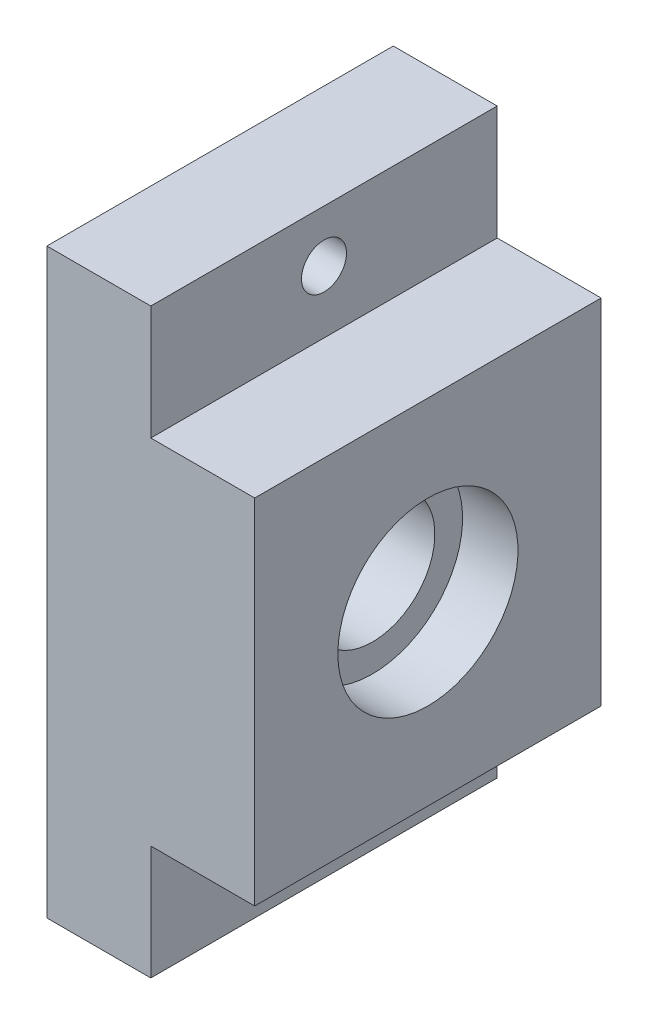
ISO-10303-21;
HEADER;
FILE_DESCRIPTION(('STEP AP214'),'2;1');
FILE_NAME('part.step','',(''),(''),'','','');
FILE_SCHEMA(('AUTOMOTIVE_DESIGN { 1 0 10303 214 1 1 1 1 }'));
ENDSEC;
DATA;
#1=APPLICATION_CONTEXT('core data for automotive mechanical design processes');
#2=APPLICATION_PROTOCOL_DEFINITION('international standard','automotive_design',2000,#1);
#3=PRODUCT_CONTEXT('',#1,'mechanical');
#4=PRODUCT('Part','Part','',(#3));
#5=PRODUCT_RELATED_PRODUCT_CATEGORY('part','',(#4));
#6=PRODUCT_DEFINITION_FORMATION('','',#4);
#7=PRODUCT_DEFINITION_CONTEXT('part definition',#1,'design');
#8=PRODUCT_DEFINITION('design','',#6,#7);
#9=PRODUCT_DEFINITION_SHAPE('','',#8);
#10=(LENGTH_UNIT() NAMED_UNIT(*) SI_UNIT(.MILLI.,.METRE.));
#11=(NAMED_UNIT(*) PLANE_ANGLE_UNIT() SI_UNIT($,.RADIAN.));
#12=(NAMED_UNIT(*) SI_UNIT($,.STERADIAN.) SOLID_ANGLE_UNIT());
#13=UNCERTAINTY_MEASURE_WITH_UNIT(LENGTH_MEASURE(1.E-05),#10,'distance_accuracy_value','');
#14=(GEOMETRIC_REPRESENTATION_CONTEXT(3) GLOBAL_UNCERTAINTY_ASSIGNED_CONTEXT((#13)) GLOBAL_UNIT_ASSIGNED_CONTEXT((#10,
#11,#12)) REPRESENTATION_CONTEXT('',''));
#15=CARTESIAN_POINT('',(0.,0.,0.));
#16=DIRECTION('',(0.,0.,1.));
#17=DIRECTION('',(1.,0.,0.));
#18=AXIS2_PLACEMENT_3D('',#15,#16,#17);
#19=CARTESIAN_POINT('',(15.,42.,50.));
#20=DIRECTION('',(0.,-1.,0.));
#21=DIRECTION('',(0.,0.,-1.));
#22=AXIS2_PLACEMENT_3D('',#19,#20,#21);
#23=PLANE('',#22);
#24=DIRECTION('',(-1.,0.,0.));
#25=VECTOR('',#24,1.);
#26=CARTESIAN_POINT('',(15.,42.,0.));
#27=LINE('',#26,#25);
#28=CARTESIAN_POINT('',(15.,42.,0.));
#29=VERTEX_POINT('',#28);
#30=CARTESIAN_POINT('',(0.,42.,0.));
#31=VERTEX_POINT('',#30);
#32=EDGE_CURVE('E128',#29,#31,#27,.T.);
#33=ORIENTED_EDGE('',*,*,#32,.T.);
#34=DIRECTION('',(0.,0.,-1.));
#35=VECTOR('',#34,1.);
#36=CARTESIAN_POINT('',(0.,42.,50.));
#37=LINE('',#36,#35);
#38=CARTESIAN_POINT('',(0.,42.,50.));
#39=VERTEX_POINT('',#38);
#40=EDGE_CURVE('E11',#39,#31,#37,.T.);
#41=ORIENTED_EDGE('',*,*,#40,.F.);
#42=DIRECTION('',(-1.,0.,0.));
#43=VECTOR('',#42,1.);
#44=CARTESIAN_POINT('',(15.,42.,50.));
#45=LINE('',#44,#43);
#46=CARTESIAN_POINT('',(15.,42.,50.));
#47=VERTEX_POINT('',#46);
#48=EDGE_CURVE('E143',#47,#39,#45,.T.);
#49=ORIENTED_EDGE('',*,*,#48,.F.);
#50=DIRECTION('',(0.,0.,-1.));
#51=VECTOR('',#50,1.);
#52=CARTESIAN_POINT('',(15.,42.,50.));
#53=LINE('',#52,#51);
#54=EDGE_CURVE('E124',#47,#29,#53,.T.);
#55=ORIENTED_EDGE('',*,*,#54,.T.);
#56=EDGE_LOOP('',(#33,#41,#49,#55));
#57=FACE_BOUND('',#56,.T.);
#58=ADVANCED_FACE('F32',(#57),#23,.F.);
#59=CARTESIAN_POINT('',(0.,42.,50.));
#60=DIRECTION('',(1.,0.,0.));
#61=DIRECTION('',(0.,0.,-1.));
#62=AXIS2_PLACEMENT_3D('',#59,#60,#61);
#63=PLANE('',#62);
#64=CARTESIAN_POINT('',(0.,0.,25.));
#65=DIRECTION('',(-1.,0.,0.));
#66=DIRECTION('',(0.,0.,1.));
#67=AXIS2_PLACEMENT_3D('',#64,#65,#66);
#68=CIRCLE('',#67,13.);
#69=CARTESIAN_POINT('',(0.,0.,38.));
#70=VERTEX_POINT('',#69);
#71=EDGE_CURVE('E187',#70,#70,#68,.T.);
#72=ORIENTED_EDGE('',*,*,#71,.F.);
#73=EDGE_LOOP('',(#72));
#74=FACE_BOUND('',#73,.T.);
#75=CARTESIAN_POINT('',(0.,-34.5,25.));
#76=DIRECTION('',(1.,0.,0.));
#77=DIRECTION('',(0.,0.,-1.));
#78=AXIS2_PLACEMENT_3D('',#75,#76,#77);
#79=CIRCLE('',#78,3.25);
#80=CARTESIAN_POINT('',(0.,-34.5,21.75));
#81=VERTEX_POINT('',#80);
#82=EDGE_CURVE('E181',#81,#81,#79,.T.);
#83=ORIENTED_EDGE('',*,*,#82,.T.);
#84=EDGE_LOOP('',(#83));
#85=FACE_BOUND('',#84,.T.);
#86=CARTESIAN_POINT('',(0.,34.5,25.));
#87=DIRECTION('',(1.,0.,0.));
#88=DIRECTION('',(0.,0.,-1.));
#89=AXIS2_PLACEMENT_3D('',#86,#87,#88);
#90=CIRCLE('',#89,3.25);
#91=CARTESIAN_POINT('',(0.,34.5,21.75));
#92=VERTEX_POINT('',#91);
#93=EDGE_CURVE('E132',#92,#92,#90,.T.);
#94=ORIENTED_EDGE('',*,*,#93,.T.);
#95=EDGE_LOOP('',(#94));
#96=FACE_BOUND('',#95,.T.);
#97=DIRECTION('',(0.,-1.,0.));
#98=VECTOR('',#97,1.);
#99=CARTESIAN_POINT('',(0.,42.,0.));
#100=LINE('',#99,#98);
#101=CARTESIAN_POINT('',(0.,-42.,0.));
#102=VERTEX_POINT('',#101);
#103=EDGE_CURVE('E131',#31,#102,#100,.T.);
#104=ORIENTED_EDGE('',*,*,#103,.T.);
#105=DIRECTION('',(0.,0.,-1.));
#106=VECTOR('',#105,1.);
#107=CARTESIAN_POINT('',(0.,-42.,50.));
#108=LINE('',#107,#106);
#109=CARTESIAN_POINT('',(0.,-42.,50.));
#110=VERTEX_POINT('',#109);
#111=EDGE_CURVE('E40',#110,#102,#108,.T.);
#112=ORIENTED_EDGE('',*,*,#111,.F.);
#113=DIRECTION('',(0.,-1.,0.));
#114=VECTOR('',#113,1.);
#115=CARTESIAN_POINT('',(0.,42.,50.));
#116=LINE('',#115,#114);
#117=EDGE_CURVE('E91',#39,#110,#116,.T.);
#118=ORIENTED_EDGE('',*,*,#117,.F.);
#119=ORIENTED_EDGE('',*,*,#40,.T.);
#120=EDGE_LOOP('',(#104,#112,#118,#119));
#121=FACE_BOUND('',#120,.T.);
#122=ADVANCED_FACE('F238',(#74,#85,#96,#121),#63,.F.);
#123=CARTESIAN_POINT('',(0.,-42.,50.));
#124=DIRECTION('',(0.,1.,0.));
#125=DIRECTION('',(0.,0.,1.));
#126=AXIS2_PLACEMENT_3D('',#123,#124,#125);
#127=PLANE('',#126);
#128=DIRECTION('',(1.,0.,0.));
#129=VECTOR('',#128,1.);
#130=CARTESIAN_POINT('',(0.,-42.,0.));
#131=LINE('',#130,#129);
#132=CARTESIAN_POINT('',(15.,-42.,0.));
#133=VERTEX_POINT('',#132);
#134=EDGE_CURVE('E134',#102,#133,#131,.T.);
#135=ORIENTED_EDGE('',*,*,#134,.T.);
#136=DIRECTION('',(0.,0.,-1.));
#137=VECTOR('',#136,1.);
#138=CARTESIAN_POINT('',(15.,-42.,50.));
#139=LINE('',#138,#137);
#140=CARTESIAN_POINT('',(15.,-42.,50.));
#141=VERTEX_POINT('',#140);
#142=EDGE_CURVE('E150',#141,#133,#139,.T.);
#143=ORIENTED_EDGE('',*,*,#142,.F.);
#144=DIRECTION('',(1.,0.,0.));
#145=VECTOR('',#144,1.);
#146=CARTESIAN_POINT('',(0.,-42.,50.));
#147=LINE('',#146,#145);
#148=EDGE_CURVE('E158',#110,#141,#147,.T.);
#149=ORIENTED_EDGE('',*,*,#148,.F.);
#150=ORIENTED_EDGE('',*,*,#111,.T.);
#151=EDGE_LOOP('',(#135,#143,#149,#150));
#152=FACE_BOUND('',#151,.T.);
#153=ADVANCED_FACE('F156',(#152),#127,.F.);
#154=CARTESIAN_POINT('',(15.,-42.,50.));
#155=DIRECTION('',(-1.,0.,0.));
#156=DIRECTION('',(0.,0.,1.));
#157=AXIS2_PLACEMENT_3D('',#154,#155,#156);
#158=PLANE('',#157);
#159=CARTESIAN_POINT('',(15.,-34.5,25.));
#160=DIRECTION('',(1.,0.,0.));
#161=DIRECTION('',(0.,0.,-1.));
#162=AXIS2_PLACEMENT_3D('',#159,#160,#161);
#163=CIRCLE('',#162,3.24999999999999);
#164=CARTESIAN_POINT('',(15.,-34.5,21.75));
#165=VERTEX_POINT('',#164);
#166=EDGE_CURVE('E184',#165,#165,#163,.T.);
#167=ORIENTED_EDGE('',*,*,#166,.F.);
#168=EDGE_LOOP('',(#167));
#169=FACE_BOUND('',#168,.T.);
#170=DIRECTION('',(0.,1.,0.));
#171=VECTOR('',#170,1.);
#172=CARTESIAN_POINT('',(15.,-42.,0.));
#173=LINE('',#172,#171);
#174=CARTESIAN_POINT('',(15.,-25.5,0.));
#175=VERTEX_POINT('',#174);
#176=EDGE_CURVE('E136',#133,#175,#173,.T.);
#177=ORIENTED_EDGE('',*,*,#176,.T.);
#178=DIRECTION('',(0.,0.,-1.));
#179=VECTOR('',#178,1.);
#180=CARTESIAN_POINT('',(15.,-25.5,50.));
#181=LINE('',#180,#179);
#182=CARTESIAN_POINT('',(15.,-25.5,50.));
#183=VERTEX_POINT('',#182);
#184=EDGE_CURVE('E147',#183,#175,#181,.T.);
#185=ORIENTED_EDGE('',*,*,#184,.F.);
#186=DIRECTION('',(0.,1.,0.));
#187=VECTOR('',#186,1.);
#188=CARTESIAN_POINT('',(15.,-42.,50.));
#189=LINE('',#188,#187);
#190=EDGE_CURVE('E170',#141,#183,#189,.T.);
#191=ORIENTED_EDGE('',*,*,#190,.F.);
#192=ORIENTED_EDGE('',*,*,#142,.T.);
#193=EDGE_LOOP('',(#177,#185,#191,#192));
#194=FACE_BOUND('',#193,.T.);
#195=ADVANCED_FACE('F166',(#169,#194),#158,.F.);
#196=CARTESIAN_POINT('',(15.,-25.5,50.));
#197=DIRECTION('',(0.,1.,0.));
#198=DIRECTION('',(0.,0.,1.));
#199=AXIS2_PLACEMENT_3D('',#196,#197,#198);
#200=PLANE('',#199);
#201=DIRECTION('',(1.,0.,0.));
#202=VECTOR('',#201,1.);
#203=CARTESIAN_POINT('',(15.,-25.5,0.));
#204=LINE('',#203,#202);
#205=CARTESIAN_POINT('',(30.,-25.5,0.));
#206=VERTEX_POINT('',#205);
#207=EDGE_CURVE('E138',#175,#206,#204,.T.);
#208=ORIENTED_EDGE('',*,*,#207,.T.);
#209=DIRECTION('',(0.,0.,-1.));
#210=VECTOR('',#209,1.);
#211=CARTESIAN_POINT('',(30.,-25.5,50.));
#212=LINE('',#211,#210);
#213=CARTESIAN_POINT('',(30.,-25.5,50.));
#214=VERTEX_POINT('',#213);
#215=EDGE_CURVE('E119',#214,#206,#212,.T.);
#216=ORIENTED_EDGE('',*,*,#215,.F.);
#217=DIRECTION('',(1.,0.,0.));
#218=VECTOR('',#217,1.);
#219=CARTESIAN_POINT('',(15.,-25.5,50.));
#220=LINE('',#219,#218);
#221=EDGE_CURVE('E110',#183,#214,#220,.T.);
#222=ORIENTED_EDGE('',*,*,#221,.F.);
#223=ORIENTED_EDGE('',*,*,#184,.T.);
#224=EDGE_LOOP('',(#208,#216,#222,#223));
#225=FACE_BOUND('',#224,.T.);
#226=ADVANCED_FACE('F169',(#225),#200,.F.);
#227=CARTESIAN_POINT('',(30.,-25.5,50.));
#228=DIRECTION('',(-1.,0.,0.));
#229=DIRECTION('',(0.,0.,1.));
#230=AXIS2_PLACEMENT_3D('',#227,#228,#229);
#231=PLANE('',#230);
#232=CARTESIAN_POINT('',(30.,0.,25.));
#233=DIRECTION('',(-1.,0.,0.));
#234=DIRECTION('',(0.,0.,1.));
#235=AXIS2_PLACEMENT_3D('',#232,#233,#234);
#236=CIRCLE('',#235,13.);
#237=CARTESIAN_POINT('',(30.,0.,38.));
#238=VERTEX_POINT('',#237);
#239=EDGE_CURVE('E202',#238,#238,#236,.T.);
#240=ORIENTED_EDGE('',*,*,#239,.T.);
#241=EDGE_LOOP('',(#240));
#242=FACE_BOUND('',#241,.T.);
#243=DIRECTION('',(0.,1.,0.));
#244=VECTOR('',#243,1.);
#245=CARTESIAN_POINT('',(30.,-25.5,0.));
#246=LINE('',#245,#244);
#247=CARTESIAN_POINT('',(30.,25.5,0.));
#248=VERTEX_POINT('',#247);
#249=EDGE_CURVE('E118',#206,#248,#246,.T.);
#250=ORIENTED_EDGE('',*,*,#249,.T.);
#251=DIRECTION('',(0.,0.,-1.));
#252=VECTOR('',#251,1.);
#253=CARTESIAN_POINT('',(30.,25.5,50.));
#254=LINE('',#253,#252);
#255=CARTESIAN_POINT('',(30.,25.5,50.));
#256=VERTEX_POINT('',#255);
#257=EDGE_CURVE('E115',#256,#248,#254,.T.);
#258=ORIENTED_EDGE('',*,*,#257,.F.);
#259=DIRECTION('',(0.,1.,0.));
#260=VECTOR('',#259,1.);
#261=CARTESIAN_POINT('',(30.,-25.5,50.));
#262=LINE('',#261,#260);
#263=EDGE_CURVE('E104',#214,#256,#262,.T.);
#264=ORIENTED_EDGE('',*,*,#263,.F.);
#265=ORIENTED_EDGE('',*,*,#215,.T.);
#266=EDGE_LOOP('',(#250,#258,#264,#265));
#267=FACE_BOUND('',#266,.T.);
#268=ADVANCED_FACE('F116',(#242,#267),#231,.F.);
#269=CARTESIAN_POINT('',(30.,25.5,50.));
#270=DIRECTION('',(0.,-1.,0.));
#271=DIRECTION('',(0.,0.,-1.));
#272=AXIS2_PLACEMENT_3D('',#269,#270,#271);
#273=PLANE('',#272);
#274=DIRECTION('',(-1.,0.,0.));
#275=VECTOR('',#274,1.);
#276=CARTESIAN_POINT('',(30.,25.5,0.));
#277=LINE('',#276,#275);
#278=CARTESIAN_POINT('',(15.,25.5,0.));
#279=VERTEX_POINT('',#278);
#280=EDGE_CURVE('E77',#248,#279,#277,.T.);
#281=ORIENTED_EDGE('',*,*,#280,.T.);
#282=DIRECTION('',(0.,0.,-1.));
#283=VECTOR('',#282,1.);
#284=CARTESIAN_POINT('',(15.,25.5,50.));
#285=LINE('',#284,#283);
#286=CARTESIAN_POINT('',(15.,25.5,50.));
#287=VERTEX_POINT('',#286);
#288=EDGE_CURVE('E120',#287,#279,#285,.T.);
#289=ORIENTED_EDGE('',*,*,#288,.F.);
#290=DIRECTION('',(-1.,0.,0.));
#291=VECTOR('',#290,1.);
#292=CARTESIAN_POINT('',(30.,25.5,50.));
#293=LINE('',#292,#291);
#294=EDGE_CURVE('E108',#256,#287,#293,.T.);
#295=ORIENTED_EDGE('',*,*,#294,.F.);
#296=ORIENTED_EDGE('',*,*,#257,.T.);
#297=EDGE_LOOP('',(#281,#289,#295,#296));
#298=FACE_BOUND('',#297,.T.);
#299=ADVANCED_FACE('F122',(#298),#273,.F.);
#300=CARTESIAN_POINT('',(15.,25.5,50.));
#301=DIRECTION('',(-1.,0.,0.));
#302=DIRECTION('',(0.,0.,1.));
#303=AXIS2_PLACEMENT_3D('',#300,#301,#302);
#304=PLANE('',#303);
#305=CARTESIAN_POINT('',(15.,34.5,25.));
#306=DIRECTION('',(1.,0.,0.));
#307=DIRECTION('',(0.,0.,-1.));
#308=AXIS2_PLACEMENT_3D('',#305,#306,#307);
#309=CIRCLE('',#308,3.24999999999999);
#310=CARTESIAN_POINT('',(15.,34.5,21.75));
#311=VERTEX_POINT('',#310);
#312=EDGE_CURVE('E178',#311,#311,#309,.T.);
#313=ORIENTED_EDGE('',*,*,#312,.F.);
#314=EDGE_LOOP('',(#313));
#315=FACE_BOUND('',#314,.T.);
#316=DIRECTION('',(0.,1.,0.));
#317=VECTOR('',#316,1.);
#318=CARTESIAN_POINT('',(15.,25.5,0.));
#319=LINE('',#318,#317);
#320=EDGE_CURVE('E83',#279,#29,#319,.T.);
#321=ORIENTED_EDGE('',*,*,#320,.T.);
#322=ORIENTED_EDGE('',*,*,#54,.F.);
#323=DIRECTION('',(0.,1.,0.));
#324=VECTOR('',#323,1.);
#325=CARTESIAN_POINT('',(15.,25.5,50.));
#326=LINE('',#325,#324);
#327=EDGE_CURVE('E48',#287,#47,#326,.T.);
#328=ORIENTED_EDGE('',*,*,#327,.F.);
#329=ORIENTED_EDGE('',*,*,#288,.T.);
#330=EDGE_LOOP('',(#321,#322,#328,#329));
#331=FACE_BOUND('',#330,.T.);
#332=ADVANCED_FACE('F247',(#315,#331),#304,.F.);
#333=CARTESIAN_POINT('',(0.,42.,50.));
#334=DIRECTION('',(0.,0.,1.));
#335=DIRECTION('',(1.,0.,0.));
#336=AXIS2_PLACEMENT_3D('',#333,#334,#335);
#337=PLANE('',#336);
#338=ORIENTED_EDGE('',*,*,#48,.T.);
#339=ORIENTED_EDGE('',*,*,#117,.T.);
#340=ORIENTED_EDGE('',*,*,#148,.T.);
#341=ORIENTED_EDGE('',*,*,#190,.T.);
#342=ORIENTED_EDGE('',*,*,#221,.T.);
#343=ORIENTED_EDGE('',*,*,#263,.T.);
#344=ORIENTED_EDGE('',*,*,#294,.T.);
#345=ORIENTED_EDGE('',*,*,#327,.T.);
#346=EDGE_LOOP('',(#338,#339,#340,#341,#342,#343,#344,#345));
#347=FACE_BOUND('',#346,.T.);
#348=ADVANCED_FACE('F106',(#347),#337,.T.);
#349=CARTESIAN_POINT('',(0.,42.,0.));
#350=DIRECTION('',(0.,0.,1.));
#351=DIRECTION('',(1.,0.,0.));
#352=AXIS2_PLACEMENT_3D('',#349,#350,#351);
#353=PLANE('',#352);
#354=ORIENTED_EDGE('',*,*,#32,.F.);
#355=ORIENTED_EDGE('',*,*,#320,.F.);
#356=ORIENTED_EDGE('',*,*,#280,.F.);
#357=ORIENTED_EDGE('',*,*,#249,.F.);
#358=ORIENTED_EDGE('',*,*,#207,.F.);
#359=ORIENTED_EDGE('',*,*,#176,.F.);
#360=ORIENTED_EDGE('',*,*,#134,.F.);
#361=ORIENTED_EDGE('',*,*,#103,.F.);
#362=EDGE_LOOP('',(#354,#355,#356,#357,#358,#359,#360,#361));
#363=FACE_BOUND('',#362,.T.);
#364=ADVANCED_FACE('F162',(#363),#353,.F.);
#365=CARTESIAN_POINT('',(15.,34.5,25.));
#366=DIRECTION('',(1.,0.,0.));
#367=DIRECTION('',(0.,0.,-1.));
#368=AXIS2_PLACEMENT_3D('',#365,#366,#367);
#369=CYLINDRICAL_SURFACE('',#368,3.24999999999999);
#370=ORIENTED_EDGE('',*,*,#93,.F.);
#371=EDGE_LOOP('',(#370));
#372=FACE_BOUND('',#371,.T.);
#373=ORIENTED_EDGE('',*,*,#312,.T.);
#374=EDGE_LOOP('',(#373));
#375=FACE_BOUND('',#374,.T.);
#376=ADVANCED_FACE('F312',(#372,#375),#369,.F.);
#377=CARTESIAN_POINT('',(15.,-34.5,25.));
#378=DIRECTION('',(1.,0.,0.));
#379=DIRECTION('',(0.,0.,-1.));
#380=AXIS2_PLACEMENT_3D('',#377,#378,#379);
#381=CYLINDRICAL_SURFACE('',#380,3.24999999999999);
#382=ORIENTED_EDGE('',*,*,#82,.F.);
#383=EDGE_LOOP('',(#382));
#384=FACE_BOUND('',#383,.T.);
#385=ORIENTED_EDGE('',*,*,#166,.T.);
#386=EDGE_LOOP('',(#385));
#387=FACE_BOUND('',#386,.T.);
#388=ADVANCED_FACE('F234',(#384,#387),#381,.F.);
#389=CARTESIAN_POINT('',(0.,0.,25.));
#390=DIRECTION('',(-1.,0.,0.));
#391=DIRECTION('',(0.,0.,1.));
#392=AXIS2_PLACEMENT_3D('',#389,#390,#391);
#393=CYLINDRICAL_SURFACE('',#392,13.);
#394=CARTESIAN_POINT('',(8.,0.,25.));
#395=DIRECTION('',(-1.,0.,0.));
#396=DIRECTION('',(0.,0.,1.));
#397=AXIS2_PLACEMENT_3D('',#394,#395,#396);
#398=CIRCLE('',#397,13.);
#399=CARTESIAN_POINT('',(8.,0.,38.));
#400=VERTEX_POINT('',#399);
#401=EDGE_CURVE('E190',#400,#400,#398,.T.);
#402=ORIENTED_EDGE('',*,*,#401,.F.);
#403=EDGE_LOOP('',(#402));
#404=FACE_BOUND('',#403,.T.);
#405=ORIENTED_EDGE('',*,*,#71,.T.);
#406=EDGE_LOOP('',(#405));
#407=FACE_BOUND('',#406,.T.);
#408=ADVANCED_FACE('F228',(#404,#407),#393,.F.);
#409=CARTESIAN_POINT('',(8.,0.,38.));
#410=DIRECTION('',(1.,0.,0.));
#411=DIRECTION('',(0.,0.,-1.));
#412=AXIS2_PLACEMENT_3D('',#409,#410,#411);
#413=PLANE('',#412);
#414=CARTESIAN_POINT('',(8.,0.,25.));
#415=DIRECTION('',(-1.,0.,0.));
#416=DIRECTION('',(0.,0.,1.));
#417=AXIS2_PLACEMENT_3D('',#414,#415,#416);
#418=CIRCLE('',#417,9.);
#419=CARTESIAN_POINT('',(8.,0.,34.));
#420=VERTEX_POINT('',#419);
#421=EDGE_CURVE('E193',#420,#420,#418,.T.);
#422=ORIENTED_EDGE('',*,*,#421,.F.);
#423=EDGE_LOOP('',(#422));
#424=FACE_BOUND('',#423,.T.);
#425=ORIENTED_EDGE('',*,*,#401,.T.);
#426=EDGE_LOOP('',(#425));
#427=FACE_BOUND('',#426,.T.);
#428=ADVANCED_FACE('F222',(#424,#427),#413,.F.);
#429=CARTESIAN_POINT('',(0.,0.,25.));
#430=DIRECTION('',(-1.,0.,0.));
#431=DIRECTION('',(0.,0.,1.));
#432=AXIS2_PLACEMENT_3D('',#429,#430,#431);
#433=CYLINDRICAL_SURFACE('',#432,9.);
#434=CARTESIAN_POINT('',(22.,0.,25.));
#435=DIRECTION('',(-1.,0.,0.));
#436=DIRECTION('',(0.,0.,1.));
#437=AXIS2_PLACEMENT_3D('',#434,#435,#436);
#438=CIRCLE('',#437,9.);
#439=CARTESIAN_POINT('',(22.,0.,34.));
#440=VERTEX_POINT('',#439);
#441=EDGE_CURVE('E196',#440,#440,#438,.T.);
#442=ORIENTED_EDGE('',*,*,#441,.F.);
#443=EDGE_LOOP('',(#442));
#444=FACE_BOUND('',#443,.T.);
#445=ORIENTED_EDGE('',*,*,#421,.T.);
#446=EDGE_LOOP('',(#445));
#447=FACE_BOUND('',#446,.T.);
#448=ADVANCED_FACE('F216',(#444,#447),#433,.F.);
#449=CARTESIAN_POINT('',(22.,0.,34.));
#450=DIRECTION('',(-1.,0.,0.));
#451=DIRECTION('',(0.,0.,1.));
#452=AXIS2_PLACEMENT_3D('',#449,#450,#451);
#453=PLANE('',#452);
#454=CARTESIAN_POINT('',(22.,0.,25.));
#455=DIRECTION('',(-1.,0.,0.));
#456=DIRECTION('',(0.,0.,1.));
#457=AXIS2_PLACEMENT_3D('',#454,#455,#456);
#458=CIRCLE('',#457,13.);
#459=CARTESIAN_POINT('',(22.,0.,38.));
#460=VERTEX_POINT('',#459);
#461=EDGE_CURVE('E199',#460,#460,#458,.T.);
#462=ORIENTED_EDGE('',*,*,#461,.F.);
#463=EDGE_LOOP('',(#462));
#464=FACE_BOUND('',#463,.T.);
#465=ORIENTED_EDGE('',*,*,#441,.T.);
#466=EDGE_LOOP('',(#465));
#467=FACE_BOUND('',#466,.T.);
#468=ADVANCED_FACE('F210',(#464,#467),#453,.F.);
#469=CARTESIAN_POINT('',(0.,0.,25.));
#470=DIRECTION('',(-1.,0.,0.));
#471=DIRECTION('',(0.,0.,1.));
#472=AXIS2_PLACEMENT_3D('',#469,#470,#471);
#473=CYLINDRICAL_SURFACE('',#472,13.);
#474=ORIENTED_EDGE('',*,*,#239,.F.);
#475=EDGE_LOOP('',(#474));
#476=FACE_BOUND('',#475,.T.);
#477=ORIENTED_EDGE('',*,*,#461,.T.);
#478=EDGE_LOOP('',(#477));
#479=FACE_BOUND('',#478,.T.);
#480=ADVANCED_FACE('F207',(#476,#479),#473,.F.);
#481=CLOSED_SHELL('',(#58,#122,#153,#195,#226,#268,#299,#332,#348,#364,#376,#388,#408,#428,#448,
#468,#480));
#482=MANIFOLD_SOLID_BREP('B2',#481);
#483=ADVANCED_BREP_SHAPE_REPRESENTATION('',(#18,#482),#14);
#484=SHAPE_DEFINITION_REPRESENTATION(#9,#483);
ENDSEC;
END-ISO-10303-21;
